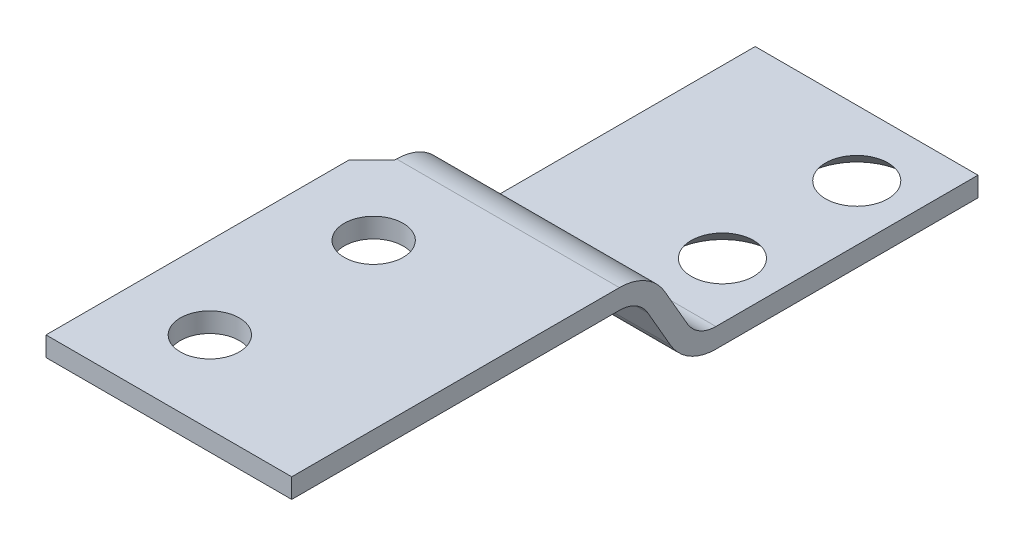
ISO-10303-21;
HEADER;
FILE_DESCRIPTION(('STEP AP214'),'2;1');
FILE_NAME('part.step','',(''),(''),'','','');
FILE_SCHEMA(('AUTOMOTIVE_DESIGN { 1 0 10303 214 1 1 1 1 }'));
ENDSEC;
DATA;
#1=APPLICATION_CONTEXT('core data for automotive mechanical design processes');
#2=APPLICATION_PROTOCOL_DEFINITION('international standard','automotive_design',2000,#1);
#3=PRODUCT_CONTEXT('',#1,'mechanical');
#4=PRODUCT('Part','Part','',(#3));
#5=PRODUCT_RELATED_PRODUCT_CATEGORY('part','',(#4));
#6=PRODUCT_DEFINITION_FORMATION('','',#4);
#7=PRODUCT_DEFINITION_CONTEXT('part definition',#1,'design');
#8=PRODUCT_DEFINITION('design','',#6,#7);
#9=PRODUCT_DEFINITION_SHAPE('','',#8);
#10=(LENGTH_UNIT() NAMED_UNIT(*) SI_UNIT(.MILLI.,.METRE.));
#11=(NAMED_UNIT(*) PLANE_ANGLE_UNIT() SI_UNIT($,.RADIAN.));
#12=(NAMED_UNIT(*) SI_UNIT($,.STERADIAN.) SOLID_ANGLE_UNIT());
#13=UNCERTAINTY_MEASURE_WITH_UNIT(LENGTH_MEASURE(1.E-05),#10,'distance_accuracy_value','');
#14=(GEOMETRIC_REPRESENTATION_CONTEXT(3) GLOBAL_UNCERTAINTY_ASSIGNED_CONTEXT((#13)) GLOBAL_UNIT_ASSIGNED_CONTEXT((#10,
#11,#12)) REPRESENTATION_CONTEXT('',''));
#15=CARTESIAN_POINT('',(0.,0.,0.));
#16=DIRECTION('',(0.,0.,1.));
#17=DIRECTION('',(1.,0.,0.));
#18=AXIS2_PLACEMENT_3D('',#15,#16,#17);
#19=CARTESIAN_POINT('',(8.60000000000116,-3.50000000003172,27.287564434668));
#20=DIRECTION('',(0.,-0.49999999999819,0.866025403785483));
#21=DIRECTION('',(0.,-0.866025403785483,-0.49999999999819));
#22=AXIS2_PLACEMENT_3D('',#19,#20,#21);
#23=PLANE('',#22);
#24=DIRECTION('',(1.,0.,0.));
#25=VECTOR('',#24,1.);
#26=CARTESIAN_POINT('',(5.06400000000108,-2.90000000004619,27.6339745961759));
#27=LINE('',#26,#25);
#28=CARTESIAN_POINT('',(12.0000000000003,-2.90000000002263,27.6339745961874));
#29=VERTEX_POINT('',#28);
#30=CARTESIAN_POINT('',(5.19999999999952,-2.90000000002496,27.6339745961908));
#31=VERTEX_POINT('',#30);
#32=EDGE_CURVE('E273',#29,#31,#27,.F.);
#33=ORIENTED_EDGE('',*,*,#32,.T.);
#34=DIRECTION('',(0.,-0.866025403785788,-0.499999999997663));
#35=VECTOR('',#34,1.);
#36=CARTESIAN_POINT('',(5.19999999999952,-2.90000000009762,27.6339745961516));
#37=LINE('',#36,#35);
#38=CARTESIAN_POINT('',(5.19999999999952,-4.10000000001919,26.9411542731702));
#39=VERTEX_POINT('',#38);
#40=EDGE_CURVE('E258',#31,#39,#37,.T.);
#41=ORIENTED_EDGE('',*,*,#40,.T.);
#42=DIRECTION('',(1.,0.,0.));
#43=VECTOR('',#42,1.);
#44=CARTESIAN_POINT('',(5.06400000000108,-4.10000000003964,26.9411542731549));
#45=LINE('',#44,#43);
#46=CARTESIAN_POINT('',(12.0000000000003,-4.10000000001734,26.941154273166));
#47=VERTEX_POINT('',#46);
#48=EDGE_CURVE('E282',#47,#39,#45,.F.);
#49=ORIENTED_EDGE('',*,*,#48,.F.);
#50=DIRECTION('',(0.,-0.866025403785483,-0.49999999999819));
#51=VECTOR('',#50,1.);
#52=CARTESIAN_POINT('',(12.0000000000003,-3.50000000003172,27.287564434668));
#53=LINE('',#52,#51);
#54=EDGE_CURVE('E276',#47,#29,#53,.F.);
#55=ORIENTED_EDGE('',*,*,#54,.T.);
#56=EDGE_LOOP('',(#33,#41,#49,#55));
#57=FACE_BOUND('',#56,.T.);
#58=ADVANCED_FACE('F19',(#57),#23,.T.);
#59=CARTESIAN_POINT('',(5.06400000000108,-3.2999999999995,25.555513627123));
#60=DIRECTION('',(1.,0.,0.));
#61=DIRECTION('',(0.,0.,-1.));
#62=AXIS2_PLACEMENT_3D('',#59,#60,#61);
#63=CYLINDRICAL_SURFACE('',#62,1.59999999999995);
#64=ORIENTED_EDGE('',*,*,#48,.T.);
#65=CARTESIAN_POINT('',(5.19999999999952,-3.2999999999995,25.555513627123));
#66=DIRECTION('',(1.,0.,0.));
#67=DIRECTION('',(0.,0.,-1.));
#68=AXIS2_PLACEMENT_3D('',#65,#66,#67);
#69=CIRCLE('',#68,1.59999999999995);
#70=CARTESIAN_POINT('',(5.19999999999952,-4.90000000000072,25.5555137523704));
#71=VERTEX_POINT('',#70);
#72=EDGE_CURVE('E255',#39,#71,#69,.T.);
#73=ORIENTED_EDGE('',*,*,#72,.T.);
#74=DIRECTION('',(1.,0.,0.));
#75=VECTOR('',#74,1.);
#76=CARTESIAN_POINT('',(8.60000000000116,-4.90000000000072,25.5555138776178));
#77=LINE('',#76,#75);
#78=CARTESIAN_POINT('',(12.0000000000003,-4.90000000000072,25.5555137523704));
#79=VERTEX_POINT('',#78);
#80=EDGE_CURVE('E197',#71,#79,#77,.T.);
#81=ORIENTED_EDGE('',*,*,#80,.T.);
#82=CARTESIAN_POINT('',(12.0000000000003,-3.2999999999995,25.555513627123));
#83=DIRECTION('',(1.,0.,0.));
#84=DIRECTION('',(0.,0.,-1.));
#85=AXIS2_PLACEMENT_3D('',#82,#83,#84);
#86=CIRCLE('',#85,1.59999999999995);
#87=EDGE_CURVE('E22',#79,#47,#86,.F.);
#88=ORIENTED_EDGE('',*,*,#87,.T.);
#89=EDGE_LOOP('',(#64,#73,#81,#88));
#90=FACE_BOUND('',#89,.T.);
#91=ADVANCED_FACE('F430',(#90),#63,.T.);
#92=CARTESIAN_POINT('',(10.2999999999994,-4.90282747790616,23.6555136271306));
#93=DIRECTION('',(0.,-1.,0.));
#94=DIRECTION('',(0.,0.,-1.));
#95=AXIS2_PLACEMENT_3D('',#92,#93,#94);
#96=CONICAL_SURFACE('',#95,1.55462769116067,0.785977484120863);
#97=CARTESIAN_POINT('',(10.2999999999994,-4.30000000000051,23.6555136271306));
#98=DIRECTION('',(0.,-1.,0.));
#99=DIRECTION('',(0.,0.,-1.));
#100=AXIS2_PLACEMENT_3D('',#97,#98,#99);
#101=CIRCLE('',#100,0.951101347408178);
#102=CARTESIAN_POINT('',(9.34889865259126,-4.30000000000057,23.6555136271306));
#103=VERTEX_POINT('',#102);
#104=CARTESIAN_POINT('',(11.2511013474076,-4.30000000000057,23.6555136271306));
#105=VERTEX_POINT('',#104);
#106=EDGE_CURVE('E268',#103,#105,#101,.T.);
#107=ORIENTED_EDGE('',*,*,#106,.F.);
#108=CARTESIAN_POINT('',(9.34889865259126,-4.30000000000064,23.6555136271306));
#109=CARTESIAN_POINT('',(9.32390784996688,-4.3249618639692,23.6554772097443));
#110=CARTESIAN_POINT('',(9.29891705050129,-4.34992372691214,23.6554379216882));
#111=CARTESIAN_POINT('',(9.24893545678048,-4.39984745277906,23.6553536042354));
#112=CARTESIAN_POINT('',(9.22394466252527,-4.42480931570305,23.6553085748382));
#113=CARTESIAN_POINT('',(9.17396308010778,-4.47473304157694,23.655212774704));
#114=CARTESIAN_POINT('',(9.1489722919455,-4.49969490452684,23.6551620039663));
#115=CARTESIAN_POINT('',(9.09899072281991,-4.54961863041779,23.655054721152));
#116=CARTESIAN_POINT('',(9.0739999418566,-4.57458049335884,23.6549982090748));
#117=CARTESIAN_POINT('',(9.02401838808917,-4.62450421922198,23.6548794435822));
#118=CARTESIAN_POINT('',(8.99902761528505,-4.64946608214407,23.6548171901663));
#119=CARTESIAN_POINT('',(8.94904607873939,-4.69938980801607,23.6546869419978));
#120=CARTESIAN_POINT('',(8.92405531499786,-4.72435167096598,23.6546189472446));
#121=CARTESIAN_POINT('',(8.87407379770236,-4.77427539683987,23.6544772164025));
#122=CARTESIAN_POINT('',(8.84908304414839,-4.79923725976386,23.6544034803131));
#123=CARTESIAN_POINT('',(8.79910154811055,-4.84916098563078,23.6542502668003));
#124=CARTESIAN_POINT('',(8.7741108056267,-4.87412284857371,23.6541707893762));
#125=CARTESIAN_POINT('',(8.74912007087859,-4.89908470979117,23.6540884412916));
#126=B_SPLINE_CURVE_WITH_KNOTS('',3,(#108,#109,#110,#111,#112,#113,#114,#115,#116,#117,#118,
#119,#120,#121,#122,#123,#124,#125),.UNSPECIFIED.,.F.,.F.,(4,2,2,2,2,2,2,2,4),(0.,
0.105965681844054,0.211931373146524,0.317897074928923,0.423862787569563,0.529828511808572,
0.635794248627245,0.741759998323502,0.847725761918858),.UNSPECIFIED.);
#127=CARTESIAN_POINT('',(8.74898612654541,-4.89959765894433,23.6540883184492));
#128=VERTEX_POINT('',#127);
#129=EDGE_CURVE('E220',#103,#128,#126,.T.);
#130=ORIENTED_EDGE('',*,*,#129,.T.);
#131=CARTESIAN_POINT('',(10.2999999999994,-4.90000000000072,23.6555136271306));
#132=DIRECTION('',(0.,1.,0.));
#133=DIRECTION('',(0.,0.,1.));
#134=AXIS2_PLACEMENT_3D('',#131,#132,#133);
#135=CIRCLE('',#134,1.5517969353228);
#136=CARTESIAN_POINT('',(11.851090316581,-4.89961604130428,23.6570569866891));
#137=VERTEX_POINT('',#136);
#138=EDGE_CURVE('E191',#128,#137,#135,.F.);
#139=ORIENTED_EDGE('',*,*,#138,.T.);
#140=CARTESIAN_POINT('',(11.8510273626869,-4.89923208544951,23.657056924049));
#141=CARTESIAN_POINT('',(11.8260304917026,-4.87426408387286,23.6569677476887));
#142=CARTESIAN_POINT('',(11.8010336116357,-4.84929608028506,23.6568816803597));
#143=CARTESIAN_POINT('',(11.7510398384769,-4.79936007309052,23.6567157637822));
#144=CARTESIAN_POINT('',(11.726042945385,-4.77439206948378,23.6566359145328));
#145=CARTESIAN_POINT('',(11.676049147332,-4.72445606227465,23.6564824341163));
#146=CARTESIAN_POINT('',(11.6510522423709,-4.69948805867228,23.6564088029485));
#147=CARTESIAN_POINT('',(11.6010584217897,-4.64955205149741,23.6562677586967));
#148=CARTESIAN_POINT('',(11.5760615061697,-4.62458404792492,23.6562003456119));
#149=CARTESIAN_POINT('',(11.5260676653478,-4.57464804079817,23.6560717375278));
#150=CARTESIAN_POINT('',(11.5010707401459,-4.54968003724392,23.6560105425277));
#151=CARTESIAN_POINT('',(11.4510768813465,-4.4997440300326,23.6558943706141));
#152=CARTESIAN_POINT('',(11.4260799477491,-4.47477602637554,23.6558393937));
#153=CARTESIAN_POINT('',(11.3760860733442,-4.42484001916059,23.6557356579594));
#154=CARTESIAN_POINT('',(11.3510891325368,-4.39987201560269,23.6556868991322));
#155=CARTESIAN_POINT('',(11.3010952448384,-4.349936008449,23.6555955995663));
#156=CARTESIAN_POINT('',(11.2760982979476,-4.3249680048532,23.655553058827));
#157=CARTESIAN_POINT('',(11.2511013474076,-4.30000000000064,23.6555136271306));
#158=B_SPLINE_CURVE_WITH_KNOTS('',3,(#140,#141,#142,#143,#144,#145,#146,#147,#148,#149,#150,
#151,#152,#153,#154,#155,#156,#157),.UNSPECIFIED.,.F.,.F.,(4,2,2,2,2,2,2,2,4),(0.,
0.105991855811852,0.211983695508652,0.317975519871003,0.423967329558899,0.529959125594109,
0.635950908998308,0.741942680110029,0.847934440111727),.UNSPECIFIED.);
#159=EDGE_CURVE('E238',#137,#105,#158,.T.);
#160=ORIENTED_EDGE('',*,*,#159,.T.);
#161=EDGE_LOOP('',(#107,#130,#139,#160));
#162=FACE_BOUND('',#161,.T.);
#163=ADVANCED_FACE('F324',(#162),#96,.F.);
#164=CARTESIAN_POINT('',(8.60000000000116,-4.59999999999938,17.5555136271296));
#165=DIRECTION('',(0.,0.,1.));
#166=DIRECTION('',(1.,0.,0.));
#167=AXIS2_PLACEMENT_3D('',#164,#165,#166);
#168=PLANE('',#167);
#169=DIRECTION('',(0.,1.,0.));
#170=VECTOR('',#169,1.);
#171=CARTESIAN_POINT('',(12.0000000000003,-4.59999999999938,17.5555136271296));
#172=LINE('',#171,#170);
#173=CARTESIAN_POINT('',(12.0000000000003,-4.90000000000072,17.5555136271296));
#174=VERTEX_POINT('',#173);
#175=CARTESIAN_POINT('',(12.0000000000003,-4.30000000000058,17.5555136271296));
#176=VERTEX_POINT('',#175);
#177=EDGE_CURVE('E110',#174,#176,#172,.T.);
#178=ORIENTED_EDGE('',*,*,#177,.F.);
#179=DIRECTION('',(1.,0.,0.));
#180=VECTOR('',#179,1.);
#181=CARTESIAN_POINT('',(8.60000000000116,-4.90000000000072,17.5555136271296));
#182=LINE('',#181,#180);
#183=CARTESIAN_POINT('',(5.19999999999952,-4.90000000000072,17.5555136271296));
#184=VERTEX_POINT('',#183);
#185=EDGE_CURVE('E199',#174,#184,#182,.F.);
#186=ORIENTED_EDGE('',*,*,#185,.T.);
#187=DIRECTION('',(0.,1.,0.));
#188=VECTOR('',#187,1.);
#189=CARTESIAN_POINT('',(5.19999999999952,-3.3499999999993,17.5555136271296));
#190=LINE('',#189,#188);
#191=CARTESIAN_POINT('',(5.19999999999952,-4.30000000000058,17.5555136271296));
#192=VERTEX_POINT('',#191);
#193=EDGE_CURVE('E252',#184,#192,#190,.T.);
#194=ORIENTED_EDGE('',*,*,#193,.T.);
#195=DIRECTION('',(1.,0.,0.));
#196=VECTOR('',#195,1.);
#197=CARTESIAN_POINT('',(8.60000000000116,-4.30000000000058,17.5555136271296));
#198=LINE('',#197,#196);
#199=EDGE_CURVE('E190',#176,#192,#198,.F.);
#200=ORIENTED_EDGE('',*,*,#199,.F.);
#201=EDGE_LOOP('',(#178,#186,#194,#200));
#202=FACE_BOUND('',#201,.T.);
#203=ADVANCED_FACE('F436',(#202),#168,.F.);
#204=CARTESIAN_POINT('',(5.19999999999952,-3.3499999999993,23.0555136271305));
#205=DIRECTION('',(1.,0.,0.));
#206=DIRECTION('',(0.,0.,-1.));
#207=AXIS2_PLACEMENT_3D('',#204,#205,#206);
#208=PLANE('',#207);
#209=DIRECTION('',(0.,0.,1.));
#210=VECTOR('',#209,1.);
#211=CARTESIAN_POINT('',(5.19999999999952,-4.30000000000058,21.5555136271288));
#212=LINE('',#211,#210);
#213=CARTESIAN_POINT('',(5.19999999999952,-4.30000000000058,25.555513627123));
#214=VERTEX_POINT('',#213);
#215=EDGE_CURVE('E194',#192,#214,#212,.T.);
#216=ORIENTED_EDGE('',*,*,#215,.F.);
#217=ORIENTED_EDGE('',*,*,#193,.F.);
#218=DIRECTION('',(0.,0.,1.));
#219=VECTOR('',#218,1.);
#220=CARTESIAN_POINT('',(5.19999999999952,-4.90000000000072,21.5555136967096));
#221=LINE('',#220,#219);
#222=EDGE_CURVE('E200',#184,#71,#221,.T.);
#223=ORIENTED_EDGE('',*,*,#222,.T.);
#224=ORIENTED_EDGE('',*,*,#72,.F.);
#225=ORIENTED_EDGE('',*,*,#40,.F.);
#226=CARTESIAN_POINT('',(5.19999999999952,-3.3999999999991,28.4999999999876));
#227=DIRECTION('',(1.,0.,0.));
#228=DIRECTION('',(0.,0.,-1.));
#229=AXIS2_PLACEMENT_3D('',#226,#227,#228);
#230=CIRCLE('',#229,1.00000000000006);
#231=CARTESIAN_POINT('',(5.19999999999952,-2.40000000000005,28.4999999999876));
#232=VERTEX_POINT('',#231);
#233=EDGE_CURVE('E315',#31,#232,#230,.T.);
#234=ORIENTED_EDGE('',*,*,#233,.T.);
#235=DIRECTION('',(0.,0.,-1.));
#236=VECTOR('',#235,1.);
#237=CARTESIAN_POINT('',(5.19999999999952,-2.40000000000005,23.0555136271305));
#238=LINE('',#237,#236);
#239=CARTESIAN_POINT('',(5.19999999999905,-2.40000000000005,28.5555136271359));
#240=VERTEX_POINT('',#239);
#241=EDGE_CURVE('E287',#240,#232,#238,.T.);
#242=ORIENTED_EDGE('',*,*,#241,.F.);
#243=DIRECTION('',(0.,1.,0.));
#244=VECTOR('',#243,1.);
#245=CARTESIAN_POINT('',(5.19999999999952,-3.3499999999993,28.5555136271364));
#246=LINE('',#245,#244);
#247=CARTESIAN_POINT('',(5.19999999999952,-1.79999999999991,28.5555136271364));
#248=VERTEX_POINT('',#247);
#249=EDGE_CURVE('E285',#248,#240,#246,.F.);
#250=ORIENTED_EDGE('',*,*,#249,.F.);
#251=DIRECTION('',(0.,0.,-1.));
#252=VECTOR('',#251,1.);
#253=CARTESIAN_POINT('',(5.19999999999952,-1.79999999999991,23.0555136271305));
#254=LINE('',#253,#252);
#255=CARTESIAN_POINT('',(5.19999999999952,-1.79999999999991,28.4999999441965));
#256=VERTEX_POINT('',#255);
#257=EDGE_CURVE('E288',#256,#248,#254,.F.);
#258=ORIENTED_EDGE('',*,*,#257,.F.);
#259=CARTESIAN_POINT('',(5.19999999999952,-3.3999999999991,28.4999999999876));
#260=DIRECTION('',(1.,0.,0.));
#261=DIRECTION('',(0.,0.,-1.));
#262=AXIS2_PLACEMENT_3D('',#259,#260,#261);
#263=CIRCLE('',#262,1.59999999999995);
#264=CARTESIAN_POINT('',(5.19999999999952,-2.60000000000746,27.1143593539335));
#265=VERTEX_POINT('',#264);
#266=EDGE_CURVE('E319',#265,#256,#263,.T.);
#267=ORIENTED_EDGE('',*,*,#266,.F.);
#268=DIRECTION('',(0.,0.866025403781974,0.500000000004269));
#269=VECTOR('',#268,1.);
#270=CARTESIAN_POINT('',(5.19999999999952,-3.80000000000004,26.4215390309082));
#271=LINE('',#270,#269);
#272=CARTESIAN_POINT('',(5.19999999999952,-3.80000000000173,26.4215390309063));
#273=VERTEX_POINT('',#272);
#274=EDGE_CURVE('E267',#273,#265,#271,.T.);
#275=ORIENTED_EDGE('',*,*,#274,.F.);
#276=CARTESIAN_POINT('',(5.19999999999952,-3.2999999999995,25.555513627123));
#277=DIRECTION('',(1.,0.,0.));
#278=DIRECTION('',(0.,0.,-1.));
#279=AXIS2_PLACEMENT_3D('',#276,#277,#278);
#280=CIRCLE('',#279,1.00000000000006);
#281=EDGE_CURVE('E245',#273,#214,#280,.T.);
#282=ORIENTED_EDGE('',*,*,#281,.T.);
#283=EDGE_LOOP('',(#216,#217,#223,#224,#225,#234,#242,#250,#258,#267,#275,#282));
#284=FACE_BOUND('',#283,.T.);
#285=ADVANCED_FACE('F366',(#284),#208,.F.);
#286=CARTESIAN_POINT('',(10.2999999999994,-4.89923208550636,19.5555136271292));
#287=DIRECTION('',(0.,-1.,0.));
#288=DIRECTION('',(0.,0.,-1.));
#289=AXIS2_PLACEMENT_3D('',#286,#287,#288);
#290=CONICAL_SURFACE('',#289,1.55102813065296,0.785977484097207);
#291=CARTESIAN_POINT('',(10.2999999999994,-4.90000000000072,19.5555136271292));
#292=DIRECTION('',(0.,1.,0.));
#293=DIRECTION('',(0.,0.,1.));
#294=AXIS2_PLACEMENT_3D('',#291,#292,#293);
#295=CIRCLE('',#294,1.55179693534384);
#296=CARTESIAN_POINT('',(10.2999999999994,-4.90000000000072,21.1073105624731));
#297=VERTEX_POINT('',#296);
#298=EDGE_CURVE('E202',#297,#297,#295,.F.);
#299=ORIENTED_EDGE('',*,*,#298,.T.);
#300=EDGE_LOOP('',(#299));
#301=FACE_BOUND('',#300,.T.);
#302=CARTESIAN_POINT('',(10.2999999999994,-4.29999999994373,19.5555136271292));
#303=DIRECTION('',(0.,-1.,0.));
#304=DIRECTION('',(0.,0.,-1.));
#305=AXIS2_PLACEMENT_3D('',#302,#303,#304);
#306=CIRCLE('',#305,0.951101347457642);
#307=CARTESIAN_POINT('',(10.2999999999994,-4.29999999994373,18.6044122796716));
#308=VERTEX_POINT('',#307);
#309=EDGE_CURVE('E302',#308,#308,#306,.T.);
#310=ORIENTED_EDGE('',*,*,#309,.F.);
#311=EDGE_LOOP('',(#310));
#312=FACE_BOUND('',#311,.T.);
#313=ADVANCED_FACE('F442',(#301,#312),#290,.F.);
#314=CARTESIAN_POINT('',(10.2999999999994,-4.89923208539267,23.6555136271306));
#315=DIRECTION('',(0.,-1.,0.));
#316=DIRECTION('',(0.,0.,-1.));
#317=AXIS2_PLACEMENT_3D('',#314,#315,#316);
#318=CONICAL_SURFACE('',#317,1.55102813043296,0.785977484097317);
#319=ORIENTED_EDGE('',*,*,#159,.F.);
#320=CARTESIAN_POINT('',(10.2999999999994,-4.90000000000072,23.6555136271306));
#321=DIRECTION('',(0.,1.,0.));
#322=DIRECTION('',(0.,0.,1.));
#323=AXIS2_PLACEMENT_3D('',#320,#321,#322);
#324=CIRCLE('',#323,1.55179693529451);
#325=EDGE_CURVE('E306',#137,#128,#324,.F.);
#326=ORIENTED_EDGE('',*,*,#325,.T.);
#327=ORIENTED_EDGE('',*,*,#129,.F.);
#328=CARTESIAN_POINT('',(10.2999999999994,-4.30000000000051,23.6555136271306));
#329=DIRECTION('',(0.,-1.,0.));
#330=DIRECTION('',(0.,0.,-1.));
#331=AXIS2_PLACEMENT_3D('',#328,#329,#330);
#332=CIRCLE('',#331,0.951101347408178);
#333=EDGE_CURVE('E186',#105,#103,#332,.T.);
#334=ORIENTED_EDGE('',*,*,#333,.F.);
#335=EDGE_LOOP('',(#319,#326,#327,#334));
#336=FACE_BOUND('',#335,.T.);
#337=ADVANCED_FACE('F228',(#336),#318,.F.);
#338=CARTESIAN_POINT('',(5.06400000000108,-3.2999999999995,25.555513627123));
#339=DIRECTION('',(1.,0.,0.));
#340=DIRECTION('',(0.,0.,-1.));
#341=AXIS2_PLACEMENT_3D('',#338,#339,#340);
#342=CYLINDRICAL_SURFACE('',#341,1.00000000000006);
#343=CARTESIAN_POINT('',(12.0000000000003,-3.2999999999995,25.555513627123));
#344=DIRECTION('',(1.,0.,0.));
#345=DIRECTION('',(0.,0.,-1.));
#346=AXIS2_PLACEMENT_3D('',#343,#344,#345);
#347=CIRCLE('',#346,1.00000000000006);
#348=CARTESIAN_POINT('',(12.0000000000003,-4.30000000000058,25.555513627123));
#349=VERTEX_POINT('',#348);
#350=CARTESIAN_POINT('',(12.0000000000003,-3.79999999999998,26.4215390309088));
#351=VERTEX_POINT('',#350);
#352=EDGE_CURVE('E249',#349,#351,#347,.F.);
#353=ORIENTED_EDGE('',*,*,#352,.F.);
#354=DIRECTION('',(1.,0.,0.));
#355=VECTOR('',#354,1.);
#356=CARTESIAN_POINT('',(8.60000000000116,-4.30000000000058,25.555513627123));
#357=LINE('',#356,#355);
#358=EDGE_CURVE('E187',#214,#349,#357,.T.);
#359=ORIENTED_EDGE('',*,*,#358,.F.);
#360=ORIENTED_EDGE('',*,*,#281,.F.);
#361=DIRECTION('',(1.,0.,0.));
#362=VECTOR('',#361,1.);
#363=CARTESIAN_POINT('',(8.60000000000116,-3.79999999999923,26.4215390309068));
#364=LINE('',#363,#362);
#365=EDGE_CURVE('E182',#273,#351,#364,.T.);
#366=ORIENTED_EDGE('',*,*,#365,.T.);
#367=EDGE_LOOP('',(#353,#359,#360,#366));
#368=FACE_BOUND('',#367,.T.);
#369=ADVANCED_FACE('F226',(#368),#342,.F.);
#370=CARTESIAN_POINT('',(5.06400000000108,-3.3999999999991,28.4999999999876));
#371=DIRECTION('',(1.,0.,0.));
#372=DIRECTION('',(0.,0.,-1.));
#373=AXIS2_PLACEMENT_3D('',#370,#371,#372);
#374=CYLINDRICAL_SURFACE('',#373,1.00000000000006);
#375=CARTESIAN_POINT('',(12.0000000000003,-3.3999999999991,28.4999999999876));
#376=DIRECTION('',(1.,0.,0.));
#377=DIRECTION('',(0.,0.,-1.));
#378=AXIS2_PLACEMENT_3D('',#375,#376,#377);
#379=CIRCLE('',#378,1.00000000000006);
#380=CARTESIAN_POINT('',(12.0000000000003,-2.40000000000005,28.4999999999876));
#381=VERTEX_POINT('',#380);
#382=EDGE_CURVE('E281',#381,#29,#379,.F.);
#383=ORIENTED_EDGE('',*,*,#382,.F.);
#384=DIRECTION('',(1.,0.,0.));
#385=VECTOR('',#384,1.);
#386=CARTESIAN_POINT('',(8.25000000000002,-2.40000000000005,28.4999999999876));
#387=LINE('',#386,#385);
#388=EDGE_CURVE('E185',#381,#232,#387,.F.);
#389=ORIENTED_EDGE('',*,*,#388,.T.);
#390=ORIENTED_EDGE('',*,*,#233,.F.);
#391=ORIENTED_EDGE('',*,*,#32,.F.);
#392=EDGE_LOOP('',(#383,#389,#390,#391));
#393=FACE_BOUND('',#392,.T.);
#394=ADVANCED_FACE('F330',(#393),#374,.F.);
#395=CARTESIAN_POINT('',(8.60000000000116,-4.90000000000072,21.5555136967096));
#396=DIRECTION('',(0.,1.,0.));
#397=DIRECTION('',(0.,0.,1.));
#398=AXIS2_PLACEMENT_3D('',#395,#396,#397);
#399=PLANE('',#398);
#400=ORIENTED_EDGE('',*,*,#138,.F.);
#401=ORIENTED_EDGE('',*,*,#325,.F.);
#402=EDGE_LOOP('',(#400,#401));
#403=FACE_BOUND('',#402,.T.);
#404=ORIENTED_EDGE('',*,*,#298,.F.);
#405=EDGE_LOOP('',(#404));
#406=FACE_BOUND('',#405,.T.);
#407=DIRECTION('',(0.,0.,-1.));
#408=VECTOR('',#407,1.);
#409=CARTESIAN_POINT('',(12.0000000000003,-4.90000000000072,28.027756813564));
#410=LINE('',#409,#408);
#411=EDGE_CURVE('E336',#79,#174,#410,.T.);
#412=ORIENTED_EDGE('',*,*,#411,.F.);
#413=ORIENTED_EDGE('',*,*,#80,.F.);
#414=ORIENTED_EDGE('',*,*,#222,.F.);
#415=ORIENTED_EDGE('',*,*,#185,.F.);
#416=EDGE_LOOP('',(#412,#413,#414,#415));
#417=FACE_BOUND('',#416,.T.);
#418=ADVANCED_FACE('F327',(#403,#406,#417),#399,.F.);
#419=CARTESIAN_POINT('',(8.60000000000116,-4.30000000000058,21.5555136271288));
#420=DIRECTION('',(0.,1.,0.));
#421=DIRECTION('',(0.,0.,1.));
#422=AXIS2_PLACEMENT_3D('',#419,#420,#421);
#423=PLANE('',#422);
#424=ORIENTED_EDGE('',*,*,#106,.T.);
#425=ORIENTED_EDGE('',*,*,#333,.T.);
#426=EDGE_LOOP('',(#424,#425));
#427=FACE_BOUND('',#426,.T.);
#428=ORIENTED_EDGE('',*,*,#309,.T.);
#429=EDGE_LOOP('',(#428));
#430=FACE_BOUND('',#429,.T.);
#431=ORIENTED_EDGE('',*,*,#199,.T.);
#432=ORIENTED_EDGE('',*,*,#215,.T.);
#433=ORIENTED_EDGE('',*,*,#358,.T.);
#434=DIRECTION('',(0.,0.,-1.));
#435=VECTOR('',#434,1.);
#436=CARTESIAN_POINT('',(12.0000000000003,-4.30000000000058,28.027756813564));
#437=LINE('',#436,#435);
#438=EDGE_CURVE('E338',#176,#349,#437,.F.);
#439=ORIENTED_EDGE('',*,*,#438,.F.);
#440=EDGE_LOOP('',(#431,#432,#433,#439));
#441=FACE_BOUND('',#440,.T.);
#442=ADVANCED_FACE('F322',(#427,#430,#441),#423,.T.);
#443=CARTESIAN_POINT('',(8.60000000000116,-3.20000000001006,26.7679491924172));
#444=DIRECTION('',(0.,-0.500000000003121,0.866025403782637));
#445=DIRECTION('',(0.,-0.866025403782637,-0.500000000003121));
#446=AXIS2_PLACEMENT_3D('',#443,#444,#445);
#447=PLANE('',#446);
#448=DIRECTION('',(0.,0.866025403784724,0.499999999999506));
#449=VECTOR('',#448,1.);
#450=CARTESIAN_POINT('',(12.0000000000003,-3.80000000000512,26.4215390309082));
#451=LINE('',#450,#449);
#452=CARTESIAN_POINT('',(12.0000000000003,-2.60000000001,27.1143593539291));
#453=VERTEX_POINT('',#452);
#454=EDGE_CURVE('E299',#351,#453,#451,.T.);
#455=ORIENTED_EDGE('',*,*,#454,.F.);
#456=ORIENTED_EDGE('',*,*,#365,.F.);
#457=ORIENTED_EDGE('',*,*,#274,.T.);
#458=DIRECTION('',(1.,0.,0.));
#459=VECTOR('',#458,1.);
#460=CARTESIAN_POINT('',(5.06400000000108,-2.60000000001759,27.1143593539219));
#461=LINE('',#460,#459);
#462=EDGE_CURVE('E178',#453,#265,#461,.F.);
#463=ORIENTED_EDGE('',*,*,#462,.F.);
#464=EDGE_LOOP('',(#455,#456,#457,#463));
#465=FACE_BOUND('',#464,.T.);
#466=ADVANCED_FACE('F386',(#465),#447,.F.);
#467=CARTESIAN_POINT('',(8.25000000000002,-2.40000000000005,33.499999999993));
#468=DIRECTION('',(0.,1.,0.));
#469=DIRECTION('',(0.,0.,1.));
#470=AXIS2_PLACEMENT_3D('',#467,#468,#469);
#471=PLANE('',#470);
#472=CARTESIAN_POINT('',(6.99999999999994,-2.40000000000005,31.000000000003));
#473=DIRECTION('',(0.,-1.,0.));
#474=DIRECTION('',(0.,0.,-1.));
#475=AXIS2_PLACEMENT_3D('',#472,#473,#474);
#476=CIRCLE('',#475,0.899999999999956);
#477=CARTESIAN_POINT('',(6.99999999999994,-2.40000000000005,30.100000000003));
#478=VERTEX_POINT('',#477);
#479=EDGE_CURVE('E165',#478,#478,#476,.F.);
#480=ORIENTED_EDGE('',*,*,#479,.T.);
#481=EDGE_LOOP('',(#480));
#482=FACE_BOUND('',#481,.T.);
#483=CARTESIAN_POINT('',(6.99999999999994,-2.40000000000005,36.0000000000084));
#484=DIRECTION('',(0.,-1.,0.));
#485=DIRECTION('',(0.,0.,-1.));
#486=AXIS2_PLACEMENT_3D('',#483,#484,#485);
#487=CIRCLE('',#486,0.899999999999956);
#488=CARTESIAN_POINT('',(6.99999999999994,-2.40000000000005,35.1000000000084));
#489=VERTEX_POINT('',#488);
#490=EDGE_CURVE('E181',#489,#489,#487,.F.);
#491=ORIENTED_EDGE('',*,*,#490,.T.);
#492=EDGE_LOOP('',(#491));
#493=FACE_BOUND('',#492,.T.);
#494=DIRECTION('',(0.,0.,-1.));
#495=VECTOR('',#494,1.);
#496=CARTESIAN_POINT('',(12.0000000000003,-2.40000000000005,28.027756813564));
#497=LINE('',#496,#495);
#498=CARTESIAN_POINT('',(12.0000000000003,-2.40000000000005,38.4999999999984));
#499=VERTEX_POINT('',#498);
#500=EDGE_CURVE('E339',#499,#381,#497,.T.);
#501=ORIENTED_EDGE('',*,*,#500,.F.);
#502=DIRECTION('',(1.,0.,0.));
#503=VECTOR('',#502,1.);
#504=CARTESIAN_POINT('',(8.25000000000002,-2.40000000000005,38.4999999999984));
#505=LINE('',#504,#503);
#506=CARTESIAN_POINT('',(4.49999999999978,-2.40000000000005,38.4999999999984));
#507=VERTEX_POINT('',#506);
#508=EDGE_CURVE('E150',#507,#499,#505,.T.);
#509=ORIENTED_EDGE('',*,*,#508,.F.);
#510=DIRECTION('',(0.,0.,-1.));
#511=VECTOR('',#510,1.);
#512=CARTESIAN_POINT('',(4.49999999999978,-2.40000000000005,33.877756813566));
#513=LINE('',#512,#511);
#514=CARTESIAN_POINT('',(4.50000000000067,-2.40000000000005,29.2555136271345));
#515=VERTEX_POINT('',#514);
#516=EDGE_CURVE('E147',#507,#515,#513,.T.);
#517=ORIENTED_EDGE('',*,*,#516,.T.);
#518=DIRECTION('',(0.707106781183698,0.,-0.707106781189398));
#519=VECTOR('',#518,1.);
#520=CARTESIAN_POINT('',(4.85000000000092,-2.40000000000005,28.905513627135));
#521=LINE('',#520,#519);
#522=EDGE_CURVE('E207',#515,#240,#521,.T.);
#523=ORIENTED_EDGE('',*,*,#522,.T.);
#524=ORIENTED_EDGE('',*,*,#241,.T.);
#525=ORIENTED_EDGE('',*,*,#388,.F.);
#526=EDGE_LOOP('',(#501,#509,#517,#523,#524,#525));
#527=FACE_BOUND('',#526,.T.);
#528=ADVANCED_FACE('F415',(#482,#493,#527),#471,.F.);
#529=CARTESIAN_POINT('',(4.85000000000092,-2.09999999999998,28.905513627135));
#530=DIRECTION('',(0.707106781189398,0.,0.707106781183698));
#531=DIRECTION('',(0.707106781183698,0.,-0.707106781189398));
#532=AXIS2_PLACEMENT_3D('',#529,#530,#531);
#533=PLANE('',#532);
#534=ORIENTED_EDGE('',*,*,#522,.F.);
#535=DIRECTION('',(0.,1.,0.));
#536=VECTOR('',#535,1.);
#537=CARTESIAN_POINT('',(4.49999999999978,-2.09999999999998,29.2555136271336));
#538=LINE('',#537,#536);
#539=CARTESIAN_POINT('',(4.49999999999978,-1.79999999999991,29.2555136271336));
#540=VERTEX_POINT('',#539);
#541=EDGE_CURVE('E172',#515,#540,#538,.T.);
#542=ORIENTED_EDGE('',*,*,#541,.T.);
#543=DIRECTION('',(-0.707106781187832,0.,0.707106781185263));
#544=VECTOR('',#543,1.);
#545=CARTESIAN_POINT('',(5.19999999999952,-1.79999999999991,28.5555136271364));
#546=LINE('',#545,#544);
#547=EDGE_CURVE('E163',#248,#540,#546,.T.);
#548=ORIENTED_EDGE('',*,*,#547,.F.);
#549=ORIENTED_EDGE('',*,*,#249,.T.);
#550=EDGE_LOOP('',(#534,#542,#548,#549));
#551=FACE_BOUND('',#550,.T.);
#552=ADVANCED_FACE('F418',(#551),#533,.F.);
#553=CARTESIAN_POINT('',(4.49999999999978,-2.09999999999998,33.877756813566));
#554=DIRECTION('',(1.,0.,0.));
#555=DIRECTION('',(0.,0.,-1.));
#556=AXIS2_PLACEMENT_3D('',#553,#554,#555);
#557=PLANE('',#556);
#558=ORIENTED_EDGE('',*,*,#516,.F.);
#559=DIRECTION('',(0.,1.,0.));
#560=VECTOR('',#559,1.);
#561=CARTESIAN_POINT('',(4.49999999999978,-2.09999999999998,38.4999999999984));
#562=LINE('',#561,#560);
#563=CARTESIAN_POINT('',(4.49999999999978,-1.79999999999991,38.4999999999984));
#564=VERTEX_POINT('',#563);
#565=EDGE_CURVE('E140',#564,#507,#562,.F.);
#566=ORIENTED_EDGE('',*,*,#565,.F.);
#567=DIRECTION('',(0.,0.,1.));
#568=VECTOR('',#567,1.);
#569=CARTESIAN_POINT('',(4.49999999999978,-1.79999999999991,33.4999999442146));
#570=LINE('',#569,#568);
#571=EDGE_CURVE('E145',#540,#564,#570,.T.);
#572=ORIENTED_EDGE('',*,*,#571,.F.);
#573=ORIENTED_EDGE('',*,*,#541,.F.);
#574=EDGE_LOOP('',(#558,#566,#572,#573));
#575=FACE_BOUND('',#574,.T.);
#576=ADVANCED_FACE('F142',(#575),#557,.F.);
#577=CARTESIAN_POINT('',(8.25000000000002,-2.09999999999998,38.4999999999984));
#578=DIRECTION('',(0.,0.,1.));
#579=DIRECTION('',(1.,0.,0.));
#580=AXIS2_PLACEMENT_3D('',#577,#578,#579);
#581=PLANE('',#580);
#582=DIRECTION('',(1.,0.,0.));
#583=VECTOR('',#582,1.);
#584=CARTESIAN_POINT('',(8.25000000000002,-1.79999999999991,38.4999999999984));
#585=LINE('',#584,#583);
#586=CARTESIAN_POINT('',(12.0000000000003,-1.79999999999991,38.4999999999984));
#587=VERTEX_POINT('',#586);
#588=EDGE_CURVE('E153',#564,#587,#585,.T.);
#589=ORIENTED_EDGE('',*,*,#588,.F.);
#590=ORIENTED_EDGE('',*,*,#565,.T.);
#591=ORIENTED_EDGE('',*,*,#508,.T.);
#592=DIRECTION('',(0.,1.,0.));
#593=VECTOR('',#592,1.);
#594=CARTESIAN_POINT('',(12.0000000000003,-3.3499999999993,38.4999999999984));
#595=LINE('',#594,#593);
#596=EDGE_CURVE('E149',#587,#499,#595,.F.);
#597=ORIENTED_EDGE('',*,*,#596,.F.);
#598=EDGE_LOOP('',(#589,#590,#591,#597));
#599=FACE_BOUND('',#598,.T.);
#600=ADVANCED_FACE('F154',(#599),#581,.T.);
#601=CARTESIAN_POINT('',(12.0000000000003,-3.3499999999993,28.027756813564));
#602=DIRECTION('',(1.,0.,0.));
#603=DIRECTION('',(0.,0.,-1.));
#604=AXIS2_PLACEMENT_3D('',#601,#602,#603);
#605=PLANE('',#604);
#606=ORIENTED_EDGE('',*,*,#352,.T.);
#607=ORIENTED_EDGE('',*,*,#454,.T.);
#608=CARTESIAN_POINT('',(12.0000000000003,-3.3999999999991,28.4999999999876));
#609=DIRECTION('',(1.,0.,0.));
#610=DIRECTION('',(0.,0.,-1.));
#611=AXIS2_PLACEMENT_3D('',#608,#609,#610);
#612=CIRCLE('',#611,1.59999999999995);
#613=CARTESIAN_POINT('',(12.0000000000003,-1.79999999999991,28.4999999441965));
#614=VERTEX_POINT('',#613);
#615=EDGE_CURVE('E37',#614,#453,#612,.F.);
#616=ORIENTED_EDGE('',*,*,#615,.F.);
#617=DIRECTION('',(0.,0.,1.));
#618=VECTOR('',#617,1.);
#619=CARTESIAN_POINT('',(12.0000000000003,-1.79999999999991,33.4999999442146));
#620=LINE('',#619,#618);
#621=EDGE_CURVE('E158',#587,#614,#620,.F.);
#622=ORIENTED_EDGE('',*,*,#621,.F.);
#623=ORIENTED_EDGE('',*,*,#596,.T.);
#624=ORIENTED_EDGE('',*,*,#500,.T.);
#625=ORIENTED_EDGE('',*,*,#382,.T.);
#626=ORIENTED_EDGE('',*,*,#54,.F.);
#627=ORIENTED_EDGE('',*,*,#87,.F.);
#628=ORIENTED_EDGE('',*,*,#411,.T.);
#629=ORIENTED_EDGE('',*,*,#177,.T.);
#630=ORIENTED_EDGE('',*,*,#438,.T.);
#631=EDGE_LOOP('',(#606,#607,#616,#622,#623,#624,#625,#626,#627,#628,#629,#630));
#632=FACE_BOUND('',#631,.T.);
#633=ADVANCED_FACE('F359',(#632),#605,.T.);
#634=CARTESIAN_POINT('',(5.06400000000108,-3.3999999999991,28.4999999999876));
#635=DIRECTION('',(1.,0.,0.));
#636=DIRECTION('',(0.,0.,-1.));
#637=AXIS2_PLACEMENT_3D('',#634,#635,#636);
#638=CYLINDRICAL_SURFACE('',#637,1.59999999999995);
#639=ORIENTED_EDGE('',*,*,#462,.T.);
#640=ORIENTED_EDGE('',*,*,#266,.T.);
#641=DIRECTION('',(1.,0.,0.));
#642=VECTOR('',#641,1.);
#643=CARTESIAN_POINT('',(8.25000000000002,-1.79999999999991,28.4999998884054));
#644=LINE('',#643,#642);
#645=EDGE_CURVE('E293',#614,#256,#644,.F.);
#646=ORIENTED_EDGE('',*,*,#645,.F.);
#647=ORIENTED_EDGE('',*,*,#615,.T.);
#648=EDGE_LOOP('',(#639,#640,#646,#647));
#649=FACE_BOUND('',#648,.T.);
#650=ADVANCED_FACE('F387',(#649),#638,.T.);
#651=CARTESIAN_POINT('',(6.99999999999994,-1.77304586537209,36.0000000000084));
#652=DIRECTION('',(0.,-1.,0.));
#653=DIRECTION('',(0.,0.,-1.));
#654=AXIS2_PLACEMENT_3D('',#651,#652,#653);
#655=CYLINDRICAL_SURFACE('',#654,0.899999999999956);
#656=ORIENTED_EDGE('',*,*,#490,.F.);
#657=EDGE_LOOP('',(#656));
#658=FACE_BOUND('',#657,.T.);
#659=CARTESIAN_POINT('',(6.99999999999994,-1.79999999999991,36.0000000000084));
#660=DIRECTION('',(0.,-1.,0.));
#661=DIRECTION('',(0.,0.,-1.));
#662=AXIS2_PLACEMENT_3D('',#659,#660,#661);
#663=CIRCLE('',#662,0.899999999999956);
#664=CARTESIAN_POINT('',(6.99999999999994,-1.79999999999991,35.1000000000084));
#665=VERTEX_POINT('',#664);
#666=EDGE_CURVE('E28',#665,#665,#663,.T.);
#667=ORIENTED_EDGE('',*,*,#666,.F.);
#668=EDGE_LOOP('',(#667));
#669=FACE_BOUND('',#668,.T.);
#670=ADVANCED_FACE('F389',(#658,#669),#655,.F.);
#671=CARTESIAN_POINT('',(6.99999999999994,-1.77304586537209,31.000000000003));
#672=DIRECTION('',(0.,-1.,0.));
#673=DIRECTION('',(0.,0.,-1.));
#674=AXIS2_PLACEMENT_3D('',#671,#672,#673);
#675=CYLINDRICAL_SURFACE('',#674,0.899999999999956);
#676=CARTESIAN_POINT('',(6.99999999999994,-1.79999999999991,31.000000000003));
#677=DIRECTION('',(0.,-1.,0.));
#678=DIRECTION('',(0.,0.,-1.));
#679=AXIS2_PLACEMENT_3D('',#676,#677,#678);
#680=CIRCLE('',#679,0.899999999999956);
#681=CARTESIAN_POINT('',(6.99999999999994,-1.79999999999991,30.100000000003));
#682=VERTEX_POINT('',#681);
#683=EDGE_CURVE('E11',#682,#682,#680,.T.);
#684=ORIENTED_EDGE('',*,*,#683,.F.);
#685=EDGE_LOOP('',(#684));
#686=FACE_BOUND('',#685,.T.);
#687=ORIENTED_EDGE('',*,*,#479,.F.);
#688=EDGE_LOOP('',(#687));
#689=FACE_BOUND('',#688,.T.);
#690=ADVANCED_FACE('F396',(#686,#689),#675,.F.);
#691=CARTESIAN_POINT('',(8.25000000000002,-1.79999999999991,33.4999999442146));
#692=DIRECTION('',(0.,1.,0.));
#693=DIRECTION('',(0.,0.,1.));
#694=AXIS2_PLACEMENT_3D('',#691,#692,#693);
#695=PLANE('',#694);
#696=ORIENTED_EDGE('',*,*,#683,.T.);
#697=EDGE_LOOP('',(#696));
#698=FACE_BOUND('',#697,.T.);
#699=ORIENTED_EDGE('',*,*,#666,.T.);
#700=EDGE_LOOP('',(#699));
#701=FACE_BOUND('',#700,.T.);
#702=ORIENTED_EDGE('',*,*,#645,.T.);
#703=ORIENTED_EDGE('',*,*,#257,.T.);
#704=ORIENTED_EDGE('',*,*,#547,.T.);
#705=ORIENTED_EDGE('',*,*,#571,.T.);
#706=ORIENTED_EDGE('',*,*,#588,.T.);
#707=ORIENTED_EDGE('',*,*,#621,.T.);
#708=EDGE_LOOP('',(#702,#703,#704,#705,#706,#707));
#709=FACE_BOUND('',#708,.T.);
#710=ADVANCED_FACE('F161',(#698,#701,#709),#695,.T.);
#711=CLOSED_SHELL('',(#58,#91,#163,#203,#285,#313,#337,#369,#394,#418,#442,#466,#528,#552,#576,
#600,#633,#650,#670,#690,#710));
#712=MANIFOLD_SOLID_BREP('B1',#711);
#713=ADVANCED_BREP_SHAPE_REPRESENTATION('',(#18,#712),#14);
#714=SHAPE_DEFINITION_REPRESENTATION(#9,#713);
ENDSEC;
END-ISO-10303-21;
